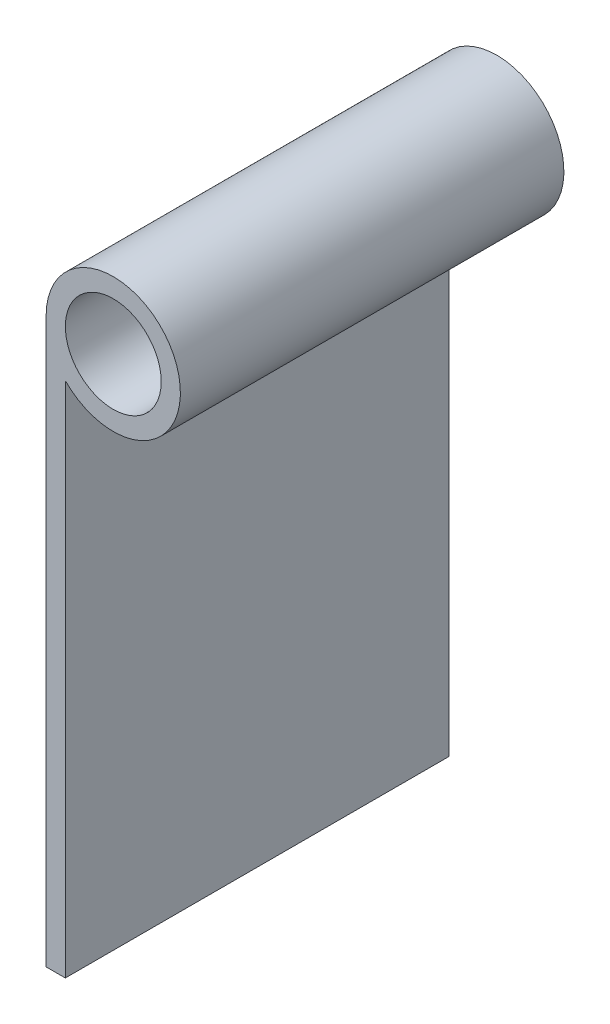
ISO-10303-21;
HEADER;
FILE_DESCRIPTION(('STEP AP214'),'2;1');
FILE_NAME('part.step','',(''),(''),'','','');
FILE_SCHEMA(('AUTOMOTIVE_DESIGN { 1 0 10303 214 1 1 1 1 }'));
ENDSEC;
DATA;
#1=APPLICATION_CONTEXT('core data for automotive mechanical design processes');
#2=APPLICATION_PROTOCOL_DEFINITION('international standard','automotive_design',2000,#1);
#3=PRODUCT_CONTEXT('',#1,'mechanical');
#4=PRODUCT('Part','Part','',(#3));
#5=PRODUCT_RELATED_PRODUCT_CATEGORY('part','',(#4));
#6=PRODUCT_DEFINITION_FORMATION('','',#4);
#7=PRODUCT_DEFINITION_CONTEXT('part definition',#1,'design');
#8=PRODUCT_DEFINITION('design','',#6,#7);
#9=PRODUCT_DEFINITION_SHAPE('','',#8);
#10=(LENGTH_UNIT() NAMED_UNIT(*) SI_UNIT(.MILLI.,.METRE.));
#11=(NAMED_UNIT(*) PLANE_ANGLE_UNIT() SI_UNIT($,.RADIAN.));
#12=(NAMED_UNIT(*) SI_UNIT($,.STERADIAN.) SOLID_ANGLE_UNIT());
#13=UNCERTAINTY_MEASURE_WITH_UNIT(LENGTH_MEASURE(1.E-05),#10,'distance_accuracy_value','');
#14=(GEOMETRIC_REPRESENTATION_CONTEXT(3) GLOBAL_UNCERTAINTY_ASSIGNED_CONTEXT((#13)) GLOBAL_UNIT_ASSIGNED_CONTEXT((#10,
#11,#12)) REPRESENTATION_CONTEXT('',''));
#15=CARTESIAN_POINT('',(0.,0.,0.));
#16=DIRECTION('',(0.,0.,1.));
#17=DIRECTION('',(1.,0.,0.));
#18=AXIS2_PLACEMENT_3D('',#15,#16,#17);
#19=CARTESIAN_POINT('',(0.,0.,50.8));
#20=DIRECTION('',(0.,0.,1.));
#21=DIRECTION('',(1.,0.,0.));
#22=AXIS2_PLACEMENT_3D('',#19,#20,#21);
#23=PLANE('',#22);
#24=CARTESIAN_POINT('',(0.,0.,50.8));
#25=DIRECTION('',(0.,0.,1.));
#26=DIRECTION('',(1.,0.,0.));
#27=AXIS2_PLACEMENT_3D('',#24,#25,#26);
#28=CIRCLE('',#27,8.89);
#29=CARTESIAN_POINT('',(-6.34999999999999,-6.22170394666928,50.8));
#30=VERTEX_POINT('',#29);
#31=CARTESIAN_POINT('',(-8.89,0.,50.8));
#32=VERTEX_POINT('',#31);
#33=EDGE_CURVE('E85',#30,#32,#28,.T.);
#34=ORIENTED_EDGE('',*,*,#33,.T.);
#35=DIRECTION('',(0.,-1.,0.));
#36=VECTOR('',#35,1.);
#37=CARTESIAN_POINT('',(-8.89,0.,50.8));
#38=LINE('',#37,#36);
#39=CARTESIAN_POINT('',(-8.89,-74.7513056395232,50.8));
#40=VERTEX_POINT('',#39);
#41=EDGE_CURVE('E80',#32,#40,#38,.T.);
#42=ORIENTED_EDGE('',*,*,#41,.T.);
#43=DIRECTION('',(1.,0.,0.));
#44=VECTOR('',#43,1.);
#45=CARTESIAN_POINT('',(-8.89,-74.7513056395232,50.8));
#46=LINE('',#45,#44);
#47=CARTESIAN_POINT('',(-6.34999999999999,-74.7513056395232,50.8));
#48=VERTEX_POINT('',#47);
#49=EDGE_CURVE('E83',#40,#48,#46,.T.);
#50=ORIENTED_EDGE('',*,*,#49,.T.);
#51=DIRECTION('',(0.,1.,0.));
#52=VECTOR('',#51,1.);
#53=CARTESIAN_POINT('',(-6.34999999999999,-74.7513056395232,50.8));
#54=LINE('',#53,#52);
#55=EDGE_CURVE('E50',#48,#30,#54,.T.);
#56=ORIENTED_EDGE('',*,*,#55,.T.);
#57=EDGE_LOOP('',(#34,#42,#50,#56));
#58=FACE_BOUND('',#57,.T.);
#59=CARTESIAN_POINT('',(0.,0.,50.8));
#60=DIRECTION('',(0.,0.,1.));
#61=DIRECTION('',(1.,0.,0.));
#62=AXIS2_PLACEMENT_3D('',#59,#60,#61);
#63=CIRCLE('',#62,6.35);
#64=CARTESIAN_POINT('',(6.35,0.,50.8));
#65=VERTEX_POINT('',#64);
#66=EDGE_CURVE('E100',#65,#65,#63,.T.);
#67=ORIENTED_EDGE('',*,*,#66,.F.);
#68=EDGE_LOOP('',(#67));
#69=FACE_BOUND('',#68,.T.);
#70=ADVANCED_FACE('F33',(#58,#69),#23,.T.);
#71=CARTESIAN_POINT('',(0.,0.,0.));
#72=DIRECTION('',(0.,0.,1.));
#73=DIRECTION('',(1.,0.,0.));
#74=AXIS2_PLACEMENT_3D('',#71,#72,#73);
#75=PLANE('',#74);
#76=CARTESIAN_POINT('',(0.,0.,0.));
#77=DIRECTION('',(0.,0.,1.));
#78=DIRECTION('',(1.,0.,0.));
#79=AXIS2_PLACEMENT_3D('',#76,#77,#78);
#80=CIRCLE('',#79,8.89);
#81=CARTESIAN_POINT('',(-6.34999999999999,-6.22170394666928,0.));
#82=VERTEX_POINT('',#81);
#83=CARTESIAN_POINT('',(-8.89,0.,0.));
#84=VERTEX_POINT('',#83);
#85=EDGE_CURVE('E97',#82,#84,#80,.T.);
#86=ORIENTED_EDGE('',*,*,#85,.F.);
#87=DIRECTION('',(0.,1.,0.));
#88=VECTOR('',#87,1.);
#89=CARTESIAN_POINT('',(-6.34999999999999,-74.7513056395232,0.));
#90=LINE('',#89,#88);
#91=CARTESIAN_POINT('',(-6.34999999999999,-74.7513056395232,0.));
#92=VERTEX_POINT('',#91);
#93=EDGE_CURVE('E73',#92,#82,#90,.T.);
#94=ORIENTED_EDGE('',*,*,#93,.F.);
#95=DIRECTION('',(1.,0.,0.));
#96=VECTOR('',#95,1.);
#97=CARTESIAN_POINT('',(-8.89,-74.7513056395232,0.));
#98=LINE('',#97,#96);
#99=CARTESIAN_POINT('',(-8.89,-74.7513056395232,0.));
#100=VERTEX_POINT('',#99);
#101=EDGE_CURVE('E67',#100,#92,#98,.T.);
#102=ORIENTED_EDGE('',*,*,#101,.F.);
#103=DIRECTION('',(0.,-1.,0.));
#104=VECTOR('',#103,1.);
#105=CARTESIAN_POINT('',(-8.89,0.,0.));
#106=LINE('',#105,#104);
#107=EDGE_CURVE('E89',#84,#100,#106,.T.);
#108=ORIENTED_EDGE('',*,*,#107,.F.);
#109=EDGE_LOOP('',(#86,#94,#102,#108));
#110=FACE_BOUND('',#109,.T.);
#111=CARTESIAN_POINT('',(0.,0.,0.));
#112=DIRECTION('',(0.,0.,1.));
#113=DIRECTION('',(1.,0.,0.));
#114=AXIS2_PLACEMENT_3D('',#111,#112,#113);
#115=CIRCLE('',#114,6.35);
#116=CARTESIAN_POINT('',(6.35,0.,0.));
#117=VERTEX_POINT('',#116);
#118=EDGE_CURVE('E112',#117,#117,#115,.T.);
#119=ORIENTED_EDGE('',*,*,#118,.T.);
#120=EDGE_LOOP('',(#119));
#121=FACE_BOUND('',#120,.T.);
#122=ADVANCED_FACE('F108',(#110,#121),#75,.F.);
#123=CARTESIAN_POINT('',(0.,0.,50.8));
#124=DIRECTION('',(0.,0.,-1.));
#125=DIRECTION('',(-1.,0.,0.));
#126=AXIS2_PLACEMENT_3D('',#123,#124,#125);
#127=CYLINDRICAL_SURFACE('',#126,8.89);
#128=ORIENTED_EDGE('',*,*,#85,.T.);
#129=DIRECTION('',(0.,0.,-1.));
#130=VECTOR('',#129,1.);
#131=CARTESIAN_POINT('',(-8.89,0.,50.8));
#132=LINE('',#131,#130);
#133=EDGE_CURVE('E11',#32,#84,#132,.T.);
#134=ORIENTED_EDGE('',*,*,#133,.F.);
#135=ORIENTED_EDGE('',*,*,#33,.F.);
#136=DIRECTION('',(0.,0.,-1.));
#137=VECTOR('',#136,1.);
#138=CARTESIAN_POINT('',(-6.34999999999999,-6.22170394666928,50.8));
#139=LINE('',#138,#137);
#140=EDGE_CURVE('E93',#30,#82,#139,.T.);
#141=ORIENTED_EDGE('',*,*,#140,.T.);
#142=EDGE_LOOP('',(#128,#134,#135,#141));
#143=FACE_BOUND('',#142,.T.);
#144=ADVANCED_FACE('F35',(#143),#127,.T.);
#145=CARTESIAN_POINT('',(-8.89,0.,50.8));
#146=DIRECTION('',(1.,0.,0.));
#147=DIRECTION('',(0.,0.,-1.));
#148=AXIS2_PLACEMENT_3D('',#145,#146,#147);
#149=PLANE('',#148);
#150=ORIENTED_EDGE('',*,*,#107,.T.);
#151=DIRECTION('',(0.,0.,-1.));
#152=VECTOR('',#151,1.);
#153=CARTESIAN_POINT('',(-8.89,-74.7513056395232,50.8));
#154=LINE('',#153,#152);
#155=EDGE_CURVE('E42',#40,#100,#154,.T.);
#156=ORIENTED_EDGE('',*,*,#155,.F.);
#157=ORIENTED_EDGE('',*,*,#41,.F.);
#158=ORIENTED_EDGE('',*,*,#133,.T.);
#159=EDGE_LOOP('',(#150,#156,#157,#158));
#160=FACE_BOUND('',#159,.T.);
#161=ADVANCED_FACE('F88',(#160),#149,.F.);
#162=CARTESIAN_POINT('',(-8.89,-74.7513056395232,50.8));
#163=DIRECTION('',(0.,1.,0.));
#164=DIRECTION('',(0.,0.,1.));
#165=AXIS2_PLACEMENT_3D('',#162,#163,#164);
#166=PLANE('',#165);
#167=ORIENTED_EDGE('',*,*,#101,.T.);
#168=DIRECTION('',(0.,0.,-1.));
#169=VECTOR('',#168,1.);
#170=CARTESIAN_POINT('',(-6.34999999999999,-74.7513056395232,50.8));
#171=LINE('',#170,#169);
#172=EDGE_CURVE('E90',#48,#92,#171,.T.);
#173=ORIENTED_EDGE('',*,*,#172,.F.);
#174=ORIENTED_EDGE('',*,*,#49,.F.);
#175=ORIENTED_EDGE('',*,*,#155,.T.);
#176=EDGE_LOOP('',(#167,#173,#174,#175));
#177=FACE_BOUND('',#176,.T.);
#178=ADVANCED_FACE('F91',(#177),#166,.F.);
#179=CARTESIAN_POINT('',(-6.34999999999999,-74.7513056395232,50.8));
#180=DIRECTION('',(-1.,0.,0.));
#181=DIRECTION('',(0.,0.,1.));
#182=AXIS2_PLACEMENT_3D('',#179,#180,#181);
#183=PLANE('',#182);
#184=ORIENTED_EDGE('',*,*,#93,.T.);
#185=ORIENTED_EDGE('',*,*,#140,.F.);
#186=ORIENTED_EDGE('',*,*,#55,.F.);
#187=ORIENTED_EDGE('',*,*,#172,.T.);
#188=EDGE_LOOP('',(#184,#185,#186,#187));
#189=FACE_BOUND('',#188,.T.);
#190=ADVANCED_FACE('F105',(#189),#183,.F.);
#191=CARTESIAN_POINT('',(0.,0.,50.8));
#192=DIRECTION('',(0.,0.,-1.));
#193=DIRECTION('',(-1.,0.,0.));
#194=AXIS2_PLACEMENT_3D('',#191,#192,#193);
#195=CYLINDRICAL_SURFACE('',#194,6.35);
#196=ORIENTED_EDGE('',*,*,#66,.T.);
#197=EDGE_LOOP('',(#196));
#198=FACE_BOUND('',#197,.T.);
#199=ORIENTED_EDGE('',*,*,#118,.F.);
#200=EDGE_LOOP('',(#199));
#201=FACE_BOUND('',#200,.T.);
#202=ADVANCED_FACE('F118',(#198,#201),#195,.F.);
#203=CLOSED_SHELL('',(#70,#122,#144,#161,#178,#190,#202));
#204=MANIFOLD_SOLID_BREP('B2',#203);
#205=ADVANCED_BREP_SHAPE_REPRESENTATION('',(#18,#204),#14);
#206=SHAPE_DEFINITION_REPRESENTATION(#9,#205);
ENDSEC;
END-ISO-10303-21;
